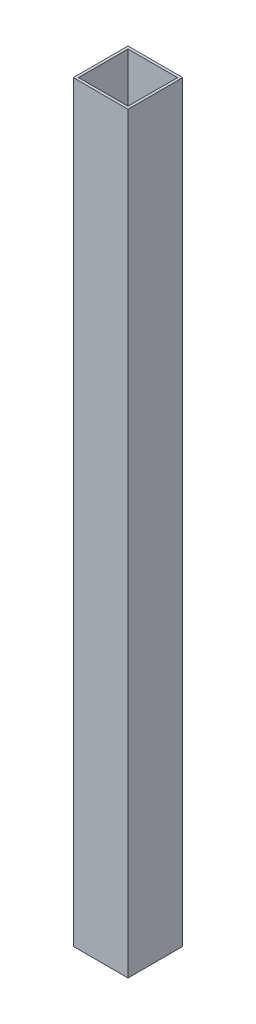
ISO-10303-21;
HEADER;
FILE_DESCRIPTION(('STEP AP214'),'2;1');
FILE_NAME('part.step','',(''),(''),'','','');
FILE_SCHEMA(('AUTOMOTIVE_DESIGN { 1 0 10303 214 1 1 1 1 }'));
ENDSEC;
DATA;
#1=APPLICATION_CONTEXT('core data for automotive mechanical design processes');
#2=APPLICATION_PROTOCOL_DEFINITION('international standard','automotive_design',2000,#1);
#3=PRODUCT_CONTEXT('',#1,'mechanical');
#4=PRODUCT('Part','Part','',(#3));
#5=PRODUCT_RELATED_PRODUCT_CATEGORY('part','',(#4));
#6=PRODUCT_DEFINITION_FORMATION('','',#4);
#7=PRODUCT_DEFINITION_CONTEXT('part definition',#1,'design');
#8=PRODUCT_DEFINITION('design','',#6,#7);
#9=PRODUCT_DEFINITION_SHAPE('','',#8);
#10=(LENGTH_UNIT() NAMED_UNIT(*) SI_UNIT(.MILLI.,.METRE.));
#11=(NAMED_UNIT(*) PLANE_ANGLE_UNIT() SI_UNIT($,.RADIAN.));
#12=(NAMED_UNIT(*) SI_UNIT($,.STERADIAN.) SOLID_ANGLE_UNIT());
#13=UNCERTAINTY_MEASURE_WITH_UNIT(LENGTH_MEASURE(1.E-05),#10,'distance_accuracy_value','');
#14=(GEOMETRIC_REPRESENTATION_CONTEXT(3) GLOBAL_UNCERTAINTY_ASSIGNED_CONTEXT((#13)) GLOBAL_UNIT_ASSIGNED_CONTEXT((#10,
#11,#12)) REPRESENTATION_CONTEXT('',''));
#15=CARTESIAN_POINT('',(0.,0.,0.));
#16=DIRECTION('',(0.,0.,1.));
#17=DIRECTION('',(1.,0.,0.));
#18=AXIS2_PLACEMENT_3D('',#15,#16,#17);
#19=CARTESIAN_POINT('',(0.,349.2,0.));
#20=DIRECTION('',(0.,-1.,0.));
#21=DIRECTION('',(0.,0.,-1.));
#22=AXIS2_PLACEMENT_3D('',#19,#20,#21);
#23=PLANE('',#22);
#24=DIRECTION('',(0.,0.,-1.));
#25=VECTOR('',#24,1.);
#26=CARTESIAN_POINT('',(12.7,349.2,12.7));
#27=LINE('',#26,#25);
#28=CARTESIAN_POINT('',(12.7,349.2,12.7));
#29=VERTEX_POINT('',#28);
#30=CARTESIAN_POINT('',(12.7,349.2,-12.7));
#31=VERTEX_POINT('',#30);
#32=EDGE_CURVE('E138',#29,#31,#27,.T.);
#33=ORIENTED_EDGE('',*,*,#32,.T.);
#34=DIRECTION('',(-1.,0.,0.));
#35=VECTOR('',#34,1.);
#36=CARTESIAN_POINT('',(-12.7,349.2,-12.7));
#37=LINE('',#36,#35);
#38=CARTESIAN_POINT('',(-12.7,349.2,-12.7));
#39=VERTEX_POINT('',#38);
#40=EDGE_CURVE('E141',#31,#39,#37,.T.);
#41=ORIENTED_EDGE('',*,*,#40,.T.);
#42=DIRECTION('',(0.,0.,1.));
#43=VECTOR('',#42,1.);
#44=CARTESIAN_POINT('',(-12.7,349.2,12.7));
#45=LINE('',#44,#43);
#46=CARTESIAN_POINT('',(-12.7,349.2,12.7));
#47=VERTEX_POINT('',#46);
#48=EDGE_CURVE('E144',#39,#47,#45,.T.);
#49=ORIENTED_EDGE('',*,*,#48,.T.);
#50=DIRECTION('',(1.,0.,0.));
#51=VECTOR('',#50,1.);
#52=CARTESIAN_POINT('',(-12.7,349.2,12.7));
#53=LINE('',#52,#51);
#54=EDGE_CURVE('E146',#47,#29,#53,.T.);
#55=ORIENTED_EDGE('',*,*,#54,.T.);
#56=EDGE_LOOP('',(#33,#41,#49,#55));
#57=FACE_BOUND('',#56,.T.);
#58=DIRECTION('',(0.,0.,1.));
#59=VECTOR('',#58,1.);
#60=CARTESIAN_POINT('',(-11.5,349.2,11.5));
#61=LINE('',#60,#59);
#62=CARTESIAN_POINT('',(-11.5,349.2,-11.5));
#63=VERTEX_POINT('',#62);
#64=CARTESIAN_POINT('',(-11.5,349.2,11.5));
#65=VERTEX_POINT('',#64);
#66=EDGE_CURVE('E102',#63,#65,#61,.T.);
#67=ORIENTED_EDGE('',*,*,#66,.F.);
#68=DIRECTION('',(-1.,0.,0.));
#69=VECTOR('',#68,1.);
#70=CARTESIAN_POINT('',(-11.5,349.2,-11.5));
#71=LINE('',#70,#69);
#72=CARTESIAN_POINT('',(11.5,349.2,-11.5));
#73=VERTEX_POINT('',#72);
#74=EDGE_CURVE('E124',#73,#63,#71,.T.);
#75=ORIENTED_EDGE('',*,*,#74,.F.);
#76=DIRECTION('',(0.,0.,-1.));
#77=VECTOR('',#76,1.);
#78=CARTESIAN_POINT('',(11.5,349.2,11.5));
#79=LINE('',#78,#77);
#80=CARTESIAN_POINT('',(11.5,349.2,11.5));
#81=VERTEX_POINT('',#80);
#82=EDGE_CURVE('E122',#81,#73,#79,.T.);
#83=ORIENTED_EDGE('',*,*,#82,.F.);
#84=DIRECTION('',(1.,0.,0.));
#85=VECTOR('',#84,1.);
#86=CARTESIAN_POINT('',(-11.5,349.2,11.5));
#87=LINE('',#86,#85);
#88=EDGE_CURVE('E110',#65,#81,#87,.T.);
#89=ORIENTED_EDGE('',*,*,#88,.F.);
#90=EDGE_LOOP('',(#67,#75,#83,#89));
#91=FACE_BOUND('',#90,.T.);
#92=ADVANCED_FACE('F37',(#57,#91),#23,.F.);
#93=CARTESIAN_POINT('',(0.,0.,0.));
#94=DIRECTION('',(0.,-1.,0.));
#95=DIRECTION('',(0.,0.,-1.));
#96=AXIS2_PLACEMENT_3D('',#93,#94,#95);
#97=PLANE('',#96);
#98=DIRECTION('',(0.,0.,-1.));
#99=VECTOR('',#98,1.);
#100=CARTESIAN_POINT('',(12.7,0.,12.7));
#101=LINE('',#100,#99);
#102=CARTESIAN_POINT('',(12.7,0.,12.7));
#103=VERTEX_POINT('',#102);
#104=CARTESIAN_POINT('',(12.7,0.,-12.7));
#105=VERTEX_POINT('',#104);
#106=EDGE_CURVE('E118',#103,#105,#101,.T.);
#107=ORIENTED_EDGE('',*,*,#106,.F.);
#108=DIRECTION('',(1.,0.,0.));
#109=VECTOR('',#108,1.);
#110=CARTESIAN_POINT('',(-12.7,0.,12.7));
#111=LINE('',#110,#109);
#112=CARTESIAN_POINT('',(-12.7,0.,12.7));
#113=VERTEX_POINT('',#112);
#114=EDGE_CURVE('E142',#113,#103,#111,.T.);
#115=ORIENTED_EDGE('',*,*,#114,.F.);
#116=DIRECTION('',(0.,0.,1.));
#117=VECTOR('',#116,1.);
#118=CARTESIAN_POINT('',(-12.7,0.,12.7));
#119=LINE('',#118,#117);
#120=CARTESIAN_POINT('',(-12.7,0.,-12.7));
#121=VERTEX_POINT('',#120);
#122=EDGE_CURVE('E153',#121,#113,#119,.T.);
#123=ORIENTED_EDGE('',*,*,#122,.F.);
#124=DIRECTION('',(-1.,0.,0.));
#125=VECTOR('',#124,1.);
#126=CARTESIAN_POINT('',(-12.7,0.,-12.7));
#127=LINE('',#126,#125);
#128=EDGE_CURVE('E151',#105,#121,#127,.T.);
#129=ORIENTED_EDGE('',*,*,#128,.F.);
#130=EDGE_LOOP('',(#107,#115,#123,#129));
#131=FACE_BOUND('',#130,.T.);
#132=DIRECTION('',(-1.,0.,0.));
#133=VECTOR('',#132,1.);
#134=CARTESIAN_POINT('',(-11.5,0.,-11.5));
#135=LINE('',#134,#133);
#136=CARTESIAN_POINT('',(11.5,0.,-11.5));
#137=VERTEX_POINT('',#136);
#138=CARTESIAN_POINT('',(-11.5,0.,-11.5));
#139=VERTEX_POINT('',#138);
#140=EDGE_CURVE('E111',#137,#139,#135,.T.);
#141=ORIENTED_EDGE('',*,*,#140,.T.);
#142=DIRECTION('',(0.,0.,1.));
#143=VECTOR('',#142,1.);
#144=CARTESIAN_POINT('',(-11.5,0.,11.5));
#145=LINE('',#144,#143);
#146=CARTESIAN_POINT('',(-11.5,0.,11.5));
#147=VERTEX_POINT('',#146);
#148=EDGE_CURVE('E60',#139,#147,#145,.T.);
#149=ORIENTED_EDGE('',*,*,#148,.T.);
#150=DIRECTION('',(1.,0.,0.));
#151=VECTOR('',#150,1.);
#152=CARTESIAN_POINT('',(-11.5,0.,11.5));
#153=LINE('',#152,#151);
#154=CARTESIAN_POINT('',(11.5,0.,11.5));
#155=VERTEX_POINT('',#154);
#156=EDGE_CURVE('E117',#147,#155,#153,.T.);
#157=ORIENTED_EDGE('',*,*,#156,.T.);
#158=DIRECTION('',(0.,0.,-1.));
#159=VECTOR('',#158,1.);
#160=CARTESIAN_POINT('',(11.5,0.,11.5));
#161=LINE('',#160,#159);
#162=EDGE_CURVE('E130',#155,#137,#161,.T.);
#163=ORIENTED_EDGE('',*,*,#162,.T.);
#164=EDGE_LOOP('',(#141,#149,#157,#163));
#165=FACE_BOUND('',#164,.T.);
#166=ADVANCED_FACE('F171',(#131,#165),#97,.T.);
#167=CARTESIAN_POINT('',(12.7,349.2,12.7));
#168=DIRECTION('',(-1.,0.,0.));
#169=DIRECTION('',(0.,0.,1.));
#170=AXIS2_PLACEMENT_3D('',#167,#168,#169);
#171=PLANE('',#170);
#172=ORIENTED_EDGE('',*,*,#106,.T.);
#173=DIRECTION('',(0.,-1.,0.));
#174=VECTOR('',#173,1.);
#175=CARTESIAN_POINT('',(12.7,349.2,-12.7));
#176=LINE('',#175,#174);
#177=EDGE_CURVE('E11',#31,#105,#176,.T.);
#178=ORIENTED_EDGE('',*,*,#177,.F.);
#179=ORIENTED_EDGE('',*,*,#32,.F.);
#180=DIRECTION('',(0.,-1.,0.));
#181=VECTOR('',#180,1.);
#182=CARTESIAN_POINT('',(12.7,349.2,12.7));
#183=LINE('',#182,#181);
#184=EDGE_CURVE('E148',#29,#103,#183,.T.);
#185=ORIENTED_EDGE('',*,*,#184,.T.);
#186=EDGE_LOOP('',(#172,#178,#179,#185));
#187=FACE_BOUND('',#186,.T.);
#188=ADVANCED_FACE('F39',(#187),#171,.F.);
#189=CARTESIAN_POINT('',(-12.7,349.2,-12.7));
#190=DIRECTION('',(0.,0.,1.));
#191=DIRECTION('',(1.,0.,0.));
#192=AXIS2_PLACEMENT_3D('',#189,#190,#191);
#193=PLANE('',#192);
#194=ORIENTED_EDGE('',*,*,#128,.T.);
#195=DIRECTION('',(0.,-1.,0.));
#196=VECTOR('',#195,1.);
#197=CARTESIAN_POINT('',(-12.7,349.2,-12.7));
#198=LINE('',#197,#196);
#199=EDGE_CURVE('E45',#39,#121,#198,.T.);
#200=ORIENTED_EDGE('',*,*,#199,.F.);
#201=ORIENTED_EDGE('',*,*,#40,.F.);
#202=ORIENTED_EDGE('',*,*,#177,.T.);
#203=EDGE_LOOP('',(#194,#200,#201,#202));
#204=FACE_BOUND('',#203,.T.);
#205=ADVANCED_FACE('F181',(#204),#193,.F.);
#206=CARTESIAN_POINT('',(-12.7,349.2,12.7));
#207=DIRECTION('',(1.,0.,0.));
#208=DIRECTION('',(0.,0.,-1.));
#209=AXIS2_PLACEMENT_3D('',#206,#207,#208);
#210=PLANE('',#209);
#211=ORIENTED_EDGE('',*,*,#122,.T.);
#212=DIRECTION('',(0.,-1.,0.));
#213=VECTOR('',#212,1.);
#214=CARTESIAN_POINT('',(-12.7,349.2,12.7));
#215=LINE('',#214,#213);
#216=EDGE_CURVE('E158',#47,#113,#215,.T.);
#217=ORIENTED_EDGE('',*,*,#216,.F.);
#218=ORIENTED_EDGE('',*,*,#48,.F.);
#219=ORIENTED_EDGE('',*,*,#199,.T.);
#220=EDGE_LOOP('',(#211,#217,#218,#219));
#221=FACE_BOUND('',#220,.T.);
#222=ADVANCED_FACE('F165',(#221),#210,.F.);
#223=CARTESIAN_POINT('',(-12.7,349.2,12.7));
#224=DIRECTION('',(0.,0.,-1.));
#225=DIRECTION('',(-1.,0.,0.));
#226=AXIS2_PLACEMENT_3D('',#223,#224,#225);
#227=PLANE('',#226);
#228=ORIENTED_EDGE('',*,*,#114,.T.);
#229=ORIENTED_EDGE('',*,*,#184,.F.);
#230=ORIENTED_EDGE('',*,*,#54,.F.);
#231=ORIENTED_EDGE('',*,*,#216,.T.);
#232=EDGE_LOOP('',(#228,#229,#230,#231));
#233=FACE_BOUND('',#232,.T.);
#234=ADVANCED_FACE('F175',(#233),#227,.F.);
#235=CARTESIAN_POINT('',(-11.5,349.2,11.5));
#236=DIRECTION('',(1.,0.,0.));
#237=DIRECTION('',(0.,0.,-1.));
#238=AXIS2_PLACEMENT_3D('',#235,#236,#237);
#239=PLANE('',#238);
#240=ORIENTED_EDGE('',*,*,#148,.F.);
#241=DIRECTION('',(0.,-1.,0.));
#242=VECTOR('',#241,1.);
#243=CARTESIAN_POINT('',(-11.5,349.2,-11.5));
#244=LINE('',#243,#242);
#245=EDGE_CURVE('E106',#63,#139,#244,.T.);
#246=ORIENTED_EDGE('',*,*,#245,.F.);
#247=ORIENTED_EDGE('',*,*,#66,.T.);
#248=DIRECTION('',(0.,-1.,0.));
#249=VECTOR('',#248,1.);
#250=CARTESIAN_POINT('',(-11.5,349.2,11.5));
#251=LINE('',#250,#249);
#252=EDGE_CURVE('E105',#65,#147,#251,.T.);
#253=ORIENTED_EDGE('',*,*,#252,.T.);
#254=EDGE_LOOP('',(#240,#246,#247,#253));
#255=FACE_BOUND('',#254,.T.);
#256=ADVANCED_FACE('F104',(#255),#239,.T.);
#257=CARTESIAN_POINT('',(-11.5,349.2,11.5));
#258=DIRECTION('',(0.,0.,-1.));
#259=DIRECTION('',(-1.,0.,0.));
#260=AXIS2_PLACEMENT_3D('',#257,#258,#259);
#261=PLANE('',#260);
#262=ORIENTED_EDGE('',*,*,#156,.F.);
#263=ORIENTED_EDGE('',*,*,#252,.F.);
#264=ORIENTED_EDGE('',*,*,#88,.T.);
#265=DIRECTION('',(0.,-1.,0.));
#266=VECTOR('',#265,1.);
#267=CARTESIAN_POINT('',(11.5,349.2,11.5));
#268=LINE('',#267,#266);
#269=EDGE_CURVE('E119',#81,#155,#268,.T.);
#270=ORIENTED_EDGE('',*,*,#269,.T.);
#271=EDGE_LOOP('',(#262,#263,#264,#270));
#272=FACE_BOUND('',#271,.T.);
#273=ADVANCED_FACE('F114',(#272),#261,.T.);
#274=CARTESIAN_POINT('',(11.5,349.2,11.5));
#275=DIRECTION('',(-1.,0.,0.));
#276=DIRECTION('',(0.,0.,1.));
#277=AXIS2_PLACEMENT_3D('',#274,#275,#276);
#278=PLANE('',#277);
#279=ORIENTED_EDGE('',*,*,#162,.F.);
#280=ORIENTED_EDGE('',*,*,#269,.F.);
#281=ORIENTED_EDGE('',*,*,#82,.T.);
#282=DIRECTION('',(0.,-1.,0.));
#283=VECTOR('',#282,1.);
#284=CARTESIAN_POINT('',(11.5,349.2,-11.5));
#285=LINE('',#284,#283);
#286=EDGE_CURVE('E52',#73,#137,#285,.T.);
#287=ORIENTED_EDGE('',*,*,#286,.T.);
#288=EDGE_LOOP('',(#279,#280,#281,#287));
#289=FACE_BOUND('',#288,.T.);
#290=ADVANCED_FACE('F204',(#289),#278,.T.);
#291=CARTESIAN_POINT('',(-11.5,349.2,-11.5));
#292=DIRECTION('',(0.,0.,1.));
#293=DIRECTION('',(1.,0.,0.));
#294=AXIS2_PLACEMENT_3D('',#291,#292,#293);
#295=PLANE('',#294);
#296=ORIENTED_EDGE('',*,*,#140,.F.);
#297=ORIENTED_EDGE('',*,*,#286,.F.);
#298=ORIENTED_EDGE('',*,*,#74,.T.);
#299=ORIENTED_EDGE('',*,*,#245,.T.);
#300=EDGE_LOOP('',(#296,#297,#298,#299));
#301=FACE_BOUND('',#300,.T.);
#302=ADVANCED_FACE('F208',(#301),#295,.T.);
#303=CLOSED_SHELL('',(#92,#166,#188,#205,#222,#234,#256,#273,#290,#302));
#304=MANIFOLD_SOLID_BREP('B2',#303);
#305=ADVANCED_BREP_SHAPE_REPRESENTATION('',(#18,#304),#14);
#306=SHAPE_DEFINITION_REPRESENTATION(#9,#305);
ENDSEC;
END-ISO-10303-21;
